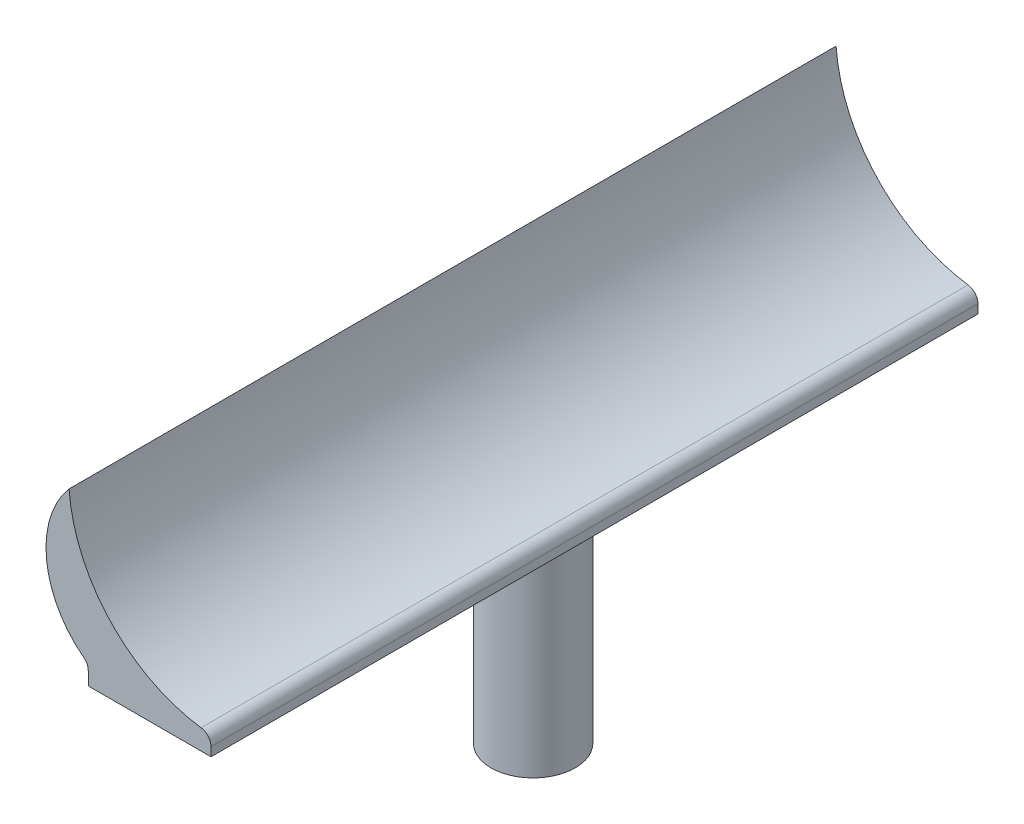
ISO-10303-21;
HEADER;
FILE_DESCRIPTION(('STEP AP214'),'2;1');
FILE_NAME('part.step','',(''),(''),'','','');
FILE_SCHEMA(('AUTOMOTIVE_DESIGN { 1 0 10303 214 1 1 1 1 }'));
ENDSEC;
DATA;
#1=APPLICATION_CONTEXT('core data for automotive mechanical design processes');
#2=APPLICATION_PROTOCOL_DEFINITION('international standard','automotive_design',2000,#1);
#3=PRODUCT_CONTEXT('',#1,'mechanical');
#4=PRODUCT('Part','Part','',(#3));
#5=PRODUCT_RELATED_PRODUCT_CATEGORY('part','',(#4));
#6=PRODUCT_DEFINITION_FORMATION('','',#4);
#7=PRODUCT_DEFINITION_CONTEXT('part definition',#1,'design');
#8=PRODUCT_DEFINITION('design','',#6,#7);
#9=PRODUCT_DEFINITION_SHAPE('','',#8);
#10=(LENGTH_UNIT() NAMED_UNIT(*) SI_UNIT(.MILLI.,.METRE.));
#11=(NAMED_UNIT(*) PLANE_ANGLE_UNIT() SI_UNIT($,.RADIAN.));
#12=(NAMED_UNIT(*) SI_UNIT($,.STERADIAN.) SOLID_ANGLE_UNIT());
#13=UNCERTAINTY_MEASURE_WITH_UNIT(LENGTH_MEASURE(1.E-05),#10,'distance_accuracy_value','');
#14=(GEOMETRIC_REPRESENTATION_CONTEXT(3) GLOBAL_UNCERTAINTY_ASSIGNED_CONTEXT((#13)) GLOBAL_UNIT_ASSIGNED_CONTEXT((#10,
#11,#12)) REPRESENTATION_CONTEXT('',''));
#15=CARTESIAN_POINT('',(0.,0.,0.));
#16=DIRECTION('',(0.,0.,1.));
#17=DIRECTION('',(1.,0.,0.));
#18=AXIS2_PLACEMENT_3D('',#15,#16,#17);
#19=CARTESIAN_POINT('',(0.,55.,0.));
#20=DIRECTION('',(0.,-1.,0.));
#21=DIRECTION('',(0.,0.,-1.));
#22=AXIS2_PLACEMENT_3D('',#19,#20,#21);
#23=CYLINDRICAL_SURFACE('',#22,11.);
#24=CARTESIAN_POINT('',(0.,55.,0.));
#25=DIRECTION('',(0.,1.,0.));
#26=DIRECTION('',(0.,0.,1.));
#27=AXIS2_PLACEMENT_3D('',#24,#25,#26);
#28=CIRCLE('',#27,11.);
#29=CARTESIAN_POINT('',(0.,55.,11.));
#30=VERTEX_POINT('',#29);
#31=EDGE_CURVE('E165',#30,#30,#28,.T.);
#32=ORIENTED_EDGE('',*,*,#31,.F.);
#33=EDGE_LOOP('',(#32));
#34=FACE_BOUND('',#33,.T.);
#35=CARTESIAN_POINT('',(0.,0.,0.));
#36=DIRECTION('',(0.,1.,0.));
#37=DIRECTION('',(0.,0.,1.));
#38=AXIS2_PLACEMENT_3D('',#35,#36,#37);
#39=CIRCLE('',#38,11.);
#40=CARTESIAN_POINT('',(0.,0.,11.));
#41=VERTEX_POINT('',#40);
#42=EDGE_CURVE('E128',#41,#41,#39,.T.);
#43=ORIENTED_EDGE('',*,*,#42,.T.);
#44=EDGE_LOOP('',(#43));
#45=FACE_BOUND('',#44,.T.);
#46=ADVANCED_FACE('F45',(#34,#45),#23,.T.);
#47=CARTESIAN_POINT('',(0.,0.,0.));
#48=DIRECTION('',(0.,1.,0.));
#49=DIRECTION('',(0.,0.,1.));
#50=AXIS2_PLACEMENT_3D('',#47,#48,#49);
#51=PLANE('',#50);
#52=ORIENTED_EDGE('',*,*,#42,.F.);
#53=EDGE_LOOP('',(#52));
#54=FACE_BOUND('',#53,.T.);
#55=ADVANCED_FACE('F208',(#54),#51,.F.);
#56=CARTESIAN_POINT('',(16.,55.,100.));
#57=DIRECTION('',(-1.,0.,0.));
#58=DIRECTION('',(0.,0.,1.));
#59=AXIS2_PLACEMENT_3D('',#56,#57,#58);
#60=PLANE('',#59);
#61=DIRECTION('',(0.,1.,0.));
#62=VECTOR('',#61,1.);
#63=CARTESIAN_POINT('',(16.,55.,-100.));
#64=LINE('',#63,#62);
#65=CARTESIAN_POINT('',(16.,55.,-100.));
#66=VERTEX_POINT('',#65);
#67=CARTESIAN_POINT('',(16.,57.3011041204456,-100.));
#68=VERTEX_POINT('',#67);
#69=EDGE_CURVE('E145',#66,#68,#64,.T.);
#70=ORIENTED_EDGE('',*,*,#69,.T.);
#71=DIRECTION('',(0.,0.,-1.));
#72=VECTOR('',#71,1.);
#73=CARTESIAN_POINT('',(16.,57.3011041204456,100.));
#74=LINE('',#73,#72);
#75=CARTESIAN_POINT('',(16.,57.3011041204456,100.));
#76=VERTEX_POINT('',#75);
#77=EDGE_CURVE('E61',#68,#76,#74,.F.);
#78=ORIENTED_EDGE('',*,*,#77,.T.);
#79=DIRECTION('',(0.,1.,0.));
#80=VECTOR('',#79,1.);
#81=CARTESIAN_POINT('',(16.,55.,100.));
#82=LINE('',#81,#80);
#83=CARTESIAN_POINT('',(16.,55.,100.));
#84=VERTEX_POINT('',#83);
#85=EDGE_CURVE('E118',#84,#76,#82,.T.);
#86=ORIENTED_EDGE('',*,*,#85,.F.);
#87=DIRECTION('',(0.,0.,-1.));
#88=VECTOR('',#87,1.);
#89=CARTESIAN_POINT('',(16.,55.,100.));
#90=LINE('',#89,#88);
#91=EDGE_CURVE('E144',#84,#66,#90,.T.);
#92=ORIENTED_EDGE('',*,*,#91,.T.);
#93=EDGE_LOOP('',(#70,#78,#86,#92));
#94=FACE_BOUND('',#93,.T.);
#95=ADVANCED_FACE('F214',(#94),#60,.F.);
#96=CARTESIAN_POINT('',(18.8950928953347,99.8950928953347,100.));
#97=DIRECTION('',(0.,0.,-1.));
#98=DIRECTION('',(-1.,0.,0.));
#99=AXIS2_PLACEMENT_3D('',#96,#97,#98);
#100=CYLINDRICAL_SURFACE('',#99,40.);
#101=CARTESIAN_POINT('',(18.8950928953347,99.8950928953347,100.));
#102=DIRECTION('',(0.,0.,-1.));
#103=DIRECTION('',(-1.,0.,0.));
#104=AXIS2_PLACEMENT_3D('',#101,#102,#103);
#105=CIRCLE('',#104,40.);
#106=CARTESIAN_POINT('',(13.4112855508373,60.272777755903,100.));
#107=VERTEX_POINT('',#106);
#108=CARTESIAN_POINT('',(-21.,97.,100.));
#109=VERTEX_POINT('',#108);
#110=EDGE_CURVE('E106',#107,#109,#105,.T.);
#111=ORIENTED_EDGE('',*,*,#110,.F.);
#112=DIRECTION('',(0.,0.,-1.));
#113=VECTOR('',#112,1.);
#114=CARTESIAN_POINT('',(13.4112855508373,60.272777755903,100.));
#115=LINE('',#114,#113);
#116=CARTESIAN_POINT('',(13.4112855508373,60.272777755903,-100.));
#117=VERTEX_POINT('',#116);
#118=EDGE_CURVE('E178',#107,#117,#115,.T.);
#119=ORIENTED_EDGE('',*,*,#118,.T.);
#120=CARTESIAN_POINT('',(18.8950928953347,99.8950928953347,-100.));
#121=DIRECTION('',(0.,0.,-1.));
#122=DIRECTION('',(-1.,0.,0.));
#123=AXIS2_PLACEMENT_3D('',#120,#121,#122);
#124=CIRCLE('',#123,40.);
#125=CARTESIAN_POINT('',(-21.,97.,-100.));
#126=VERTEX_POINT('',#125);
#127=EDGE_CURVE('E123',#117,#126,#124,.T.);
#128=ORIENTED_EDGE('',*,*,#127,.T.);
#129=DIRECTION('',(0.,0.,-1.));
#130=VECTOR('',#129,1.);
#131=CARTESIAN_POINT('',(-21.,97.,100.));
#132=LINE('',#131,#130);
#133=EDGE_CURVE('E121',#109,#126,#132,.T.);
#134=ORIENTED_EDGE('',*,*,#133,.F.);
#135=EDGE_LOOP('',(#111,#119,#128,#134));
#136=FACE_BOUND('',#135,.T.);
#137=ADVANCED_FACE('F122',(#136),#100,.F.);
#138=CARTESIAN_POINT('',(-2.02149132334484,80.7268254968453,100.));
#139=DIRECTION('',(0.,0.,-1.));
#140=DIRECTION('',(-1.,0.,0.));
#141=AXIS2_PLACEMENT_3D('',#138,#139,#140);
#142=CYLINDRICAL_SURFACE('',#141,25.);
#143=CARTESIAN_POINT('',(-2.02149132334484,80.7268254968453,-100.));
#144=DIRECTION('',(0.,0.,1.));
#145=DIRECTION('',(-1.,0.,0.));
#146=AXIS2_PLACEMENT_3D('',#143,#144,#145);
#147=CIRCLE('',#146,25.);
#148=CARTESIAN_POINT('',(-17.1808740703584,60.8473608478778,-100.));
#149=VERTEX_POINT('',#148);
#150=EDGE_CURVE('E150',#126,#149,#147,.T.);
#151=ORIENTED_EDGE('',*,*,#150,.T.);
#152=DIRECTION('',(0.,0.,-1.));
#153=VECTOR('',#152,1.);
#154=CARTESIAN_POINT('',(-17.1808740703584,60.8473608478778,100.));
#155=LINE('',#154,#153);
#156=CARTESIAN_POINT('',(-17.1808740703584,60.8473608478778,100.));
#157=VERTEX_POINT('',#156);
#158=EDGE_CURVE('E133',#149,#157,#155,.F.);
#159=ORIENTED_EDGE('',*,*,#158,.T.);
#160=CARTESIAN_POINT('',(-2.02149132334484,80.7268254968453,100.));
#161=DIRECTION('',(0.,0.,1.));
#162=DIRECTION('',(-1.,0.,0.));
#163=AXIS2_PLACEMENT_3D('',#160,#161,#162);
#164=CIRCLE('',#163,25.);
#165=EDGE_CURVE('E110',#109,#157,#164,.T.);
#166=ORIENTED_EDGE('',*,*,#165,.F.);
#167=ORIENTED_EDGE('',*,*,#133,.T.);
#168=EDGE_LOOP('',(#151,#159,#166,#167));
#169=FACE_BOUND('',#168,.T.);
#170=ADVANCED_FACE('F131',(#169),#142,.T.);
#171=CARTESIAN_POINT('',(-16.,55.,100.));
#172=DIRECTION('',(1.,0.,0.));
#173=DIRECTION('',(0.,0.,-1.));
#174=AXIS2_PLACEMENT_3D('',#171,#172,#173);
#175=PLANE('',#174);
#176=DIRECTION('',(0.,-1.,0.));
#177=VECTOR('',#176,1.);
#178=CARTESIAN_POINT('',(-16.,55.,100.));
#179=LINE('',#178,#177);
#180=CARTESIAN_POINT('',(-16.,58.4618250900017,100.));
#181=VERTEX_POINT('',#180);
#182=CARTESIAN_POINT('',(-16.,55.,100.));
#183=VERTEX_POINT('',#182);
#184=EDGE_CURVE('E135',#181,#183,#179,.T.);
#185=ORIENTED_EDGE('',*,*,#184,.F.);
#186=DIRECTION('',(0.,0.,1.));
#187=VECTOR('',#186,1.);
#188=CARTESIAN_POINT('',(-16.,58.4618250900017,-100.));
#189=LINE('',#188,#187);
#190=CARTESIAN_POINT('',(-16.,58.4618250900017,-100.));
#191=VERTEX_POINT('',#190);
#192=EDGE_CURVE('E169',#181,#191,#189,.F.);
#193=ORIENTED_EDGE('',*,*,#192,.T.);
#194=DIRECTION('',(0.,-1.,0.));
#195=VECTOR('',#194,1.);
#196=CARTESIAN_POINT('',(-16.,55.,-100.));
#197=LINE('',#196,#195);
#198=CARTESIAN_POINT('',(-16.,55.,-100.));
#199=VERTEX_POINT('',#198);
#200=EDGE_CURVE('E153',#191,#199,#197,.T.);
#201=ORIENTED_EDGE('',*,*,#200,.T.);
#202=DIRECTION('',(0.,0.,-1.));
#203=VECTOR('',#202,1.);
#204=CARTESIAN_POINT('',(-16.,55.,100.));
#205=LINE('',#204,#203);
#206=EDGE_CURVE('E129',#183,#199,#205,.T.);
#207=ORIENTED_EDGE('',*,*,#206,.F.);
#208=EDGE_LOOP('',(#185,#193,#201,#207));
#209=FACE_BOUND('',#208,.T.);
#210=ADVANCED_FACE('F196',(#209),#175,.F.);
#211=CARTESIAN_POINT('',(16.,55.,100.));
#212=DIRECTION('',(0.,1.,0.));
#213=DIRECTION('',(0.,0.,1.));
#214=AXIS2_PLACEMENT_3D('',#211,#212,#213);
#215=PLANE('',#214);
#216=ORIENTED_EDGE('',*,*,#31,.T.);
#217=EDGE_LOOP('',(#216));
#218=FACE_BOUND('',#217,.T.);
#219=DIRECTION('',(1.,0.,0.));
#220=VECTOR('',#219,1.);
#221=CARTESIAN_POINT('',(16.,55.,-100.));
#222=LINE('',#221,#220);
#223=EDGE_CURVE('E156',#199,#66,#222,.T.);
#224=ORIENTED_EDGE('',*,*,#223,.T.);
#225=ORIENTED_EDGE('',*,*,#91,.F.);
#226=DIRECTION('',(1.,0.,0.));
#227=VECTOR('',#226,1.);
#228=CARTESIAN_POINT('',(16.,55.,100.));
#229=LINE('',#228,#227);
#230=EDGE_CURVE('E138',#183,#84,#229,.T.);
#231=ORIENTED_EDGE('',*,*,#230,.F.);
#232=ORIENTED_EDGE('',*,*,#206,.T.);
#233=EDGE_LOOP('',(#224,#225,#231,#232));
#234=FACE_BOUND('',#233,.T.);
#235=ADVANCED_FACE('F200',(#218,#234),#215,.F.);
#236=CARTESIAN_POINT('',(18.8950928953347,99.8950928953347,100.));
#237=DIRECTION('',(0.,0.,-1.));
#238=DIRECTION('',(-1.,0.,0.));
#239=AXIS2_PLACEMENT_3D('',#236,#237,#238);
#240=PLANE('',#239);
#241=ORIENTED_EDGE('',*,*,#85,.T.);
#242=CARTESIAN_POINT('',(13.,57.3011041204456,100.));
#243=DIRECTION('',(0.,0.,-1.));
#244=DIRECTION('',(-1.,0.,0.));
#245=AXIS2_PLACEMENT_3D('',#242,#243,#244);
#246=CIRCLE('',#245,3.);
#247=EDGE_CURVE('E113',#76,#107,#246,.F.);
#248=ORIENTED_EDGE('',*,*,#247,.T.);
#249=ORIENTED_EDGE('',*,*,#110,.T.);
#250=ORIENTED_EDGE('',*,*,#165,.T.);
#251=CARTESIAN_POINT('',(-19.,58.4618250900017,100.));
#252=DIRECTION('',(0.,0.,-1.));
#253=DIRECTION('',(-1.,0.,0.));
#254=AXIS2_PLACEMENT_3D('',#251,#252,#253);
#255=CIRCLE('',#254,3.);
#256=EDGE_CURVE('E11',#157,#181,#255,.T.);
#257=ORIENTED_EDGE('',*,*,#256,.T.);
#258=ORIENTED_EDGE('',*,*,#184,.T.);
#259=ORIENTED_EDGE('',*,*,#230,.T.);
#260=EDGE_LOOP('',(#241,#248,#249,#250,#257,#258,#259));
#261=FACE_BOUND('',#260,.T.);
#262=ADVANCED_FACE('F108',(#261),#240,.F.);
#263=CARTESIAN_POINT('',(18.8950928953347,99.8950928953347,-100.));
#264=DIRECTION('',(0.,0.,-1.));
#265=DIRECTION('',(-1.,0.,0.));
#266=AXIS2_PLACEMENT_3D('',#263,#264,#265);
#267=PLANE('',#266);
#268=ORIENTED_EDGE('',*,*,#127,.F.);
#269=CARTESIAN_POINT('',(13.,57.3011041204456,-100.));
#270=DIRECTION('',(0.,0.,-1.));
#271=DIRECTION('',(-1.,0.,0.));
#272=AXIS2_PLACEMENT_3D('',#269,#270,#271);
#273=CIRCLE('',#272,3.);
#274=EDGE_CURVE('E69',#117,#68,#273,.T.);
#275=ORIENTED_EDGE('',*,*,#274,.T.);
#276=ORIENTED_EDGE('',*,*,#69,.F.);
#277=ORIENTED_EDGE('',*,*,#223,.F.);
#278=ORIENTED_EDGE('',*,*,#200,.F.);
#279=CARTESIAN_POINT('',(-19.,58.4618250900017,-100.));
#280=DIRECTION('',(0.,0.,-1.));
#281=DIRECTION('',(-1.,0.,0.));
#282=AXIS2_PLACEMENT_3D('',#279,#280,#281);
#283=CIRCLE('',#282,3.);
#284=EDGE_CURVE('E54',#191,#149,#283,.F.);
#285=ORIENTED_EDGE('',*,*,#284,.T.);
#286=ORIENTED_EDGE('',*,*,#150,.F.);
#287=EDGE_LOOP('',(#268,#275,#276,#277,#278,#285,#286));
#288=FACE_BOUND('',#287,.T.);
#289=ADVANCED_FACE('F188',(#288),#267,.T.);
#290=CARTESIAN_POINT('',(-19.,58.4618250900017,100.));
#291=DIRECTION('',(0.,0.,-1.));
#292=DIRECTION('',(-1.,0.,0.));
#293=AXIS2_PLACEMENT_3D('',#290,#291,#292);
#294=CYLINDRICAL_SURFACE('',#293,3.);
#295=ORIENTED_EDGE('',*,*,#256,.F.);
#296=ORIENTED_EDGE('',*,*,#158,.F.);
#297=ORIENTED_EDGE('',*,*,#284,.F.);
#298=ORIENTED_EDGE('',*,*,#192,.F.);
#299=EDGE_LOOP('',(#295,#296,#297,#298));
#300=FACE_BOUND('',#299,.T.);
#301=ADVANCED_FACE('F192',(#300),#294,.F.);
#302=CARTESIAN_POINT('',(13.,57.3011041204456,100.));
#303=DIRECTION('',(0.,0.,-1.));
#304=DIRECTION('',(-1.,0.,0.));
#305=AXIS2_PLACEMENT_3D('',#302,#303,#304);
#306=CYLINDRICAL_SURFACE('',#305,3.);
#307=ORIENTED_EDGE('',*,*,#247,.F.);
#308=ORIENTED_EDGE('',*,*,#77,.F.);
#309=ORIENTED_EDGE('',*,*,#274,.F.);
#310=ORIENTED_EDGE('',*,*,#118,.F.);
#311=EDGE_LOOP('',(#307,#308,#309,#310));
#312=FACE_BOUND('',#311,.T.);
#313=ADVANCED_FACE('F47',(#312),#306,.T.);
#314=CLOSED_SHELL('',(#46,#55,#95,#137,#170,#210,#235,#262,#289,#301,#313));
#315=MANIFOLD_SOLID_BREP('B2',#314);
#316=ADVANCED_BREP_SHAPE_REPRESENTATION('',(#18,#315),#14);
#317=SHAPE_DEFINITION_REPRESENTATION(#9,#316);
ENDSEC;
END-ISO-10303-21;
